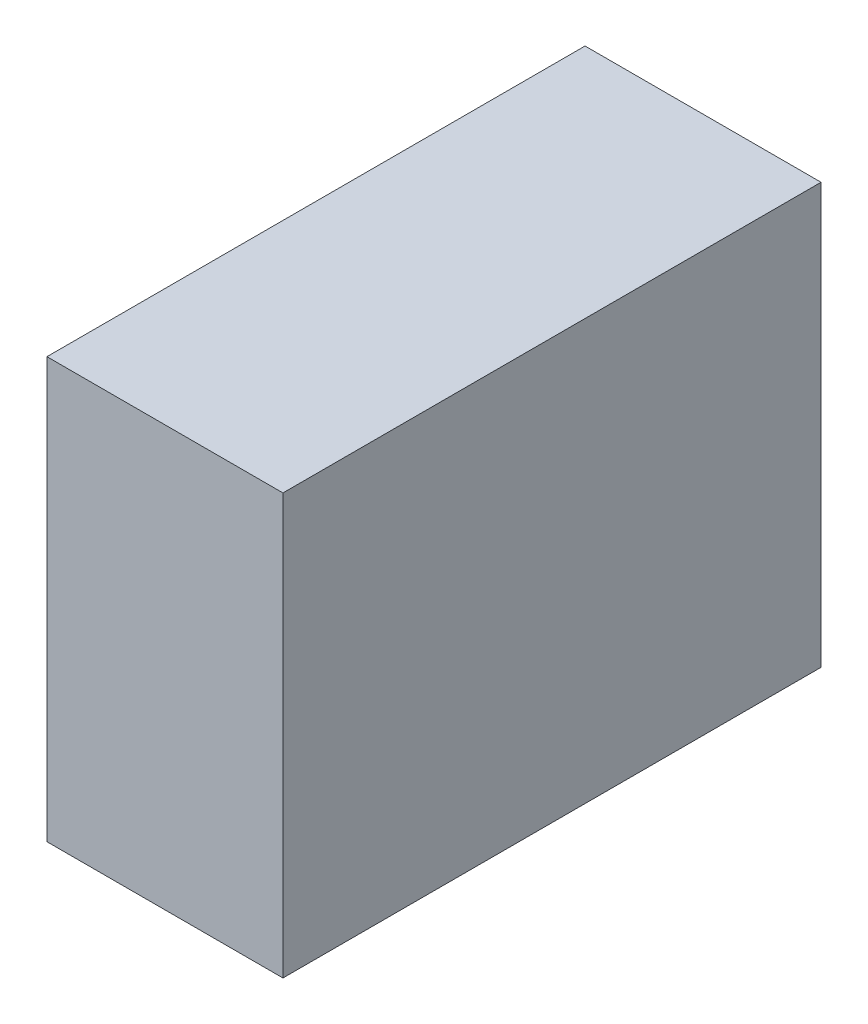
ISO-10303-21;
HEADER;
FILE_DESCRIPTION(('STEP AP214'),'2;1');
FILE_NAME('part.step','',(''),(''),'','','');
FILE_SCHEMA(('AUTOMOTIVE_DESIGN { 1 0 10303 214 1 1 1 1 }'));
ENDSEC;
DATA;
#1=APPLICATION_CONTEXT('core data for automotive mechanical design processes');
#2=APPLICATION_PROTOCOL_DEFINITION('international standard','automotive_design',2000,#1);
#3=PRODUCT_CONTEXT('',#1,'mechanical');
#4=PRODUCT('Part','Part','',(#3));
#5=PRODUCT_RELATED_PRODUCT_CATEGORY('part','',(#4));
#6=PRODUCT_DEFINITION_FORMATION('','',#4);
#7=PRODUCT_DEFINITION_CONTEXT('part definition',#1,'design');
#8=PRODUCT_DEFINITION('design','',#6,#7);
#9=PRODUCT_DEFINITION_SHAPE('','',#8);
#10=(LENGTH_UNIT() NAMED_UNIT(*) SI_UNIT(.MILLI.,.METRE.));
#11=(NAMED_UNIT(*) PLANE_ANGLE_UNIT() SI_UNIT($,.RADIAN.));
#12=(NAMED_UNIT(*) SI_UNIT($,.STERADIAN.) SOLID_ANGLE_UNIT());
#13=UNCERTAINTY_MEASURE_WITH_UNIT(LENGTH_MEASURE(1.E-05),#10,'distance_accuracy_value','');
#14=(GEOMETRIC_REPRESENTATION_CONTEXT(3) GLOBAL_UNCERTAINTY_ASSIGNED_CONTEXT((#13)) GLOBAL_UNIT_ASSIGNED_CONTEXT((#10,
#11,#12)) REPRESENTATION_CONTEXT('',''));
#15=CARTESIAN_POINT('',(0.,0.,0.));
#16=DIRECTION('',(0.,0.,1.));
#17=DIRECTION('',(1.,0.,0.));
#18=AXIS2_PLACEMENT_3D('',#15,#16,#17);
#19=CARTESIAN_POINT('',(0.,0.,114.));
#20=DIRECTION('',(1.,0.,0.));
#21=DIRECTION('',(0.,0.,-1.));
#22=AXIS2_PLACEMENT_3D('',#19,#20,#21);
#23=PLANE('',#22);
#24=DIRECTION('',(0.,-1.,0.));
#25=VECTOR('',#24,1.);
#26=CARTESIAN_POINT('',(0.,0.,0.));
#27=LINE('',#26,#25);
#28=CARTESIAN_POINT('',(0.,89.,0.));
#29=VERTEX_POINT('',#28);
#30=CARTESIAN_POINT('',(0.,0.,0.));
#31=VERTEX_POINT('',#30);
#32=EDGE_CURVE('E98',#29,#31,#27,.T.);
#33=ORIENTED_EDGE('',*,*,#32,.T.);
#34=DIRECTION('',(0.,0.,-1.));
#35=VECTOR('',#34,1.);
#36=CARTESIAN_POINT('',(0.,0.,114.));
#37=LINE('',#36,#35);
#38=CARTESIAN_POINT('',(0.,0.,114.));
#39=VERTEX_POINT('',#38);
#40=EDGE_CURVE('E11',#39,#31,#37,.T.);
#41=ORIENTED_EDGE('',*,*,#40,.F.);
#42=DIRECTION('',(0.,-1.,0.));
#43=VECTOR('',#42,1.);
#44=CARTESIAN_POINT('',(0.,0.,114.));
#45=LINE('',#44,#43);
#46=CARTESIAN_POINT('',(0.,89.,114.));
#47=VERTEX_POINT('',#46);
#48=EDGE_CURVE('E86',#47,#39,#45,.T.);
#49=ORIENTED_EDGE('',*,*,#48,.F.);
#50=DIRECTION('',(0.,0.,-1.));
#51=VECTOR('',#50,1.);
#52=CARTESIAN_POINT('',(0.,89.,114.));
#53=LINE('',#52,#51);
#54=EDGE_CURVE('E94',#47,#29,#53,.T.);
#55=ORIENTED_EDGE('',*,*,#54,.T.);
#56=EDGE_LOOP('',(#33,#41,#49,#55));
#57=FACE_BOUND('',#56,.T.);
#58=ADVANCED_FACE('F35',(#57),#23,.F.);
#59=CARTESIAN_POINT('',(0.,0.,114.));
#60=DIRECTION('',(0.,1.,0.));
#61=DIRECTION('',(0.,0.,1.));
#62=AXIS2_PLACEMENT_3D('',#59,#60,#61);
#63=PLANE('',#62);
#64=DIRECTION('',(1.,0.,0.));
#65=VECTOR('',#64,1.);
#66=CARTESIAN_POINT('',(0.,0.,0.));
#67=LINE('',#66,#65);
#68=CARTESIAN_POINT('',(50.,0.,0.));
#69=VERTEX_POINT('',#68);
#70=EDGE_CURVE('E90',#31,#69,#67,.T.);
#71=ORIENTED_EDGE('',*,*,#70,.T.);
#72=DIRECTION('',(0.,0.,-1.));
#73=VECTOR('',#72,1.);
#74=CARTESIAN_POINT('',(50.,0.,114.));
#75=LINE('',#74,#73);
#76=CARTESIAN_POINT('',(50.,0.,114.));
#77=VERTEX_POINT('',#76);
#78=EDGE_CURVE('E43',#77,#69,#75,.T.);
#79=ORIENTED_EDGE('',*,*,#78,.F.);
#80=DIRECTION('',(1.,0.,0.));
#81=VECTOR('',#80,1.);
#82=CARTESIAN_POINT('',(0.,0.,114.));
#83=LINE('',#82,#81);
#84=EDGE_CURVE('E81',#39,#77,#83,.T.);
#85=ORIENTED_EDGE('',*,*,#84,.F.);
#86=ORIENTED_EDGE('',*,*,#40,.T.);
#87=EDGE_LOOP('',(#71,#79,#85,#86));
#88=FACE_BOUND('',#87,.T.);
#89=ADVANCED_FACE('F89',(#88),#63,.F.);
#90=CARTESIAN_POINT('',(50.,0.,114.));
#91=DIRECTION('',(-1.,0.,0.));
#92=DIRECTION('',(0.,0.,1.));
#93=AXIS2_PLACEMENT_3D('',#90,#91,#92);
#94=PLANE('',#93);
#95=DIRECTION('',(0.,1.,0.));
#96=VECTOR('',#95,1.);
#97=CARTESIAN_POINT('',(50.,0.,0.));
#98=LINE('',#97,#96);
#99=CARTESIAN_POINT('',(50.,89.,0.));
#100=VERTEX_POINT('',#99);
#101=EDGE_CURVE('E68',#69,#100,#98,.T.);
#102=ORIENTED_EDGE('',*,*,#101,.T.);
#103=DIRECTION('',(0.,0.,-1.));
#104=VECTOR('',#103,1.);
#105=CARTESIAN_POINT('',(50.,89.,114.));
#106=LINE('',#105,#104);
#107=CARTESIAN_POINT('',(50.,89.,114.));
#108=VERTEX_POINT('',#107);
#109=EDGE_CURVE('E91',#108,#100,#106,.T.);
#110=ORIENTED_EDGE('',*,*,#109,.F.);
#111=DIRECTION('',(0.,1.,0.));
#112=VECTOR('',#111,1.);
#113=CARTESIAN_POINT('',(50.,0.,114.));
#114=LINE('',#113,#112);
#115=EDGE_CURVE('E84',#77,#108,#114,.T.);
#116=ORIENTED_EDGE('',*,*,#115,.F.);
#117=ORIENTED_EDGE('',*,*,#78,.T.);
#118=EDGE_LOOP('',(#102,#110,#116,#117));
#119=FACE_BOUND('',#118,.T.);
#120=ADVANCED_FACE('F92',(#119),#94,.F.);
#121=CARTESIAN_POINT('',(0.,89.,114.));
#122=DIRECTION('',(0.,-1.,0.));
#123=DIRECTION('',(0.,0.,-1.));
#124=AXIS2_PLACEMENT_3D('',#121,#122,#123);
#125=PLANE('',#124);
#126=DIRECTION('',(-1.,0.,0.));
#127=VECTOR('',#126,1.);
#128=CARTESIAN_POINT('',(0.,89.,0.));
#129=LINE('',#128,#127);
#130=EDGE_CURVE('E74',#100,#29,#129,.T.);
#131=ORIENTED_EDGE('',*,*,#130,.T.);
#132=ORIENTED_EDGE('',*,*,#54,.F.);
#133=DIRECTION('',(-1.,0.,0.));
#134=VECTOR('',#133,1.);
#135=CARTESIAN_POINT('',(0.,89.,114.));
#136=LINE('',#135,#134);
#137=EDGE_CURVE('E51',#108,#47,#136,.T.);
#138=ORIENTED_EDGE('',*,*,#137,.F.);
#139=ORIENTED_EDGE('',*,*,#109,.T.);
#140=EDGE_LOOP('',(#131,#132,#138,#139));
#141=FACE_BOUND('',#140,.T.);
#142=ADVANCED_FACE('F105',(#141),#125,.F.);
#143=CARTESIAN_POINT('',(0.,0.,114.));
#144=DIRECTION('',(0.,0.,-1.));
#145=DIRECTION('',(-1.,0.,0.));
#146=AXIS2_PLACEMENT_3D('',#143,#144,#145);
#147=PLANE('',#146);
#148=ORIENTED_EDGE('',*,*,#48,.T.);
#149=ORIENTED_EDGE('',*,*,#84,.T.);
#150=ORIENTED_EDGE('',*,*,#115,.T.);
#151=ORIENTED_EDGE('',*,*,#137,.T.);
#152=EDGE_LOOP('',(#148,#149,#150,#151));
#153=FACE_BOUND('',#152,.T.);
#154=ADVANCED_FACE('F82',(#153),#147,.F.);
#155=CARTESIAN_POINT('',(0.,0.,0.));
#156=DIRECTION('',(0.,0.,-1.));
#157=DIRECTION('',(-1.,0.,0.));
#158=AXIS2_PLACEMENT_3D('',#155,#156,#157);
#159=PLANE('',#158);
#160=ORIENTED_EDGE('',*,*,#32,.F.);
#161=ORIENTED_EDGE('',*,*,#130,.F.);
#162=ORIENTED_EDGE('',*,*,#101,.F.);
#163=ORIENTED_EDGE('',*,*,#70,.F.);
#164=EDGE_LOOP('',(#160,#161,#162,#163));
#165=FACE_BOUND('',#164,.T.);
#166=ADVANCED_FACE('F108',(#165),#159,.T.);
#167=CLOSED_SHELL('',(#58,#89,#120,#142,#154,#166));
#168=MANIFOLD_SOLID_BREP('B2',#167);
#169=ADVANCED_BREP_SHAPE_REPRESENTATION('',(#18,#168),#14);
#170=SHAPE_DEFINITION_REPRESENTATION(#9,#169);
ENDSEC;
END-ISO-10303-21;
